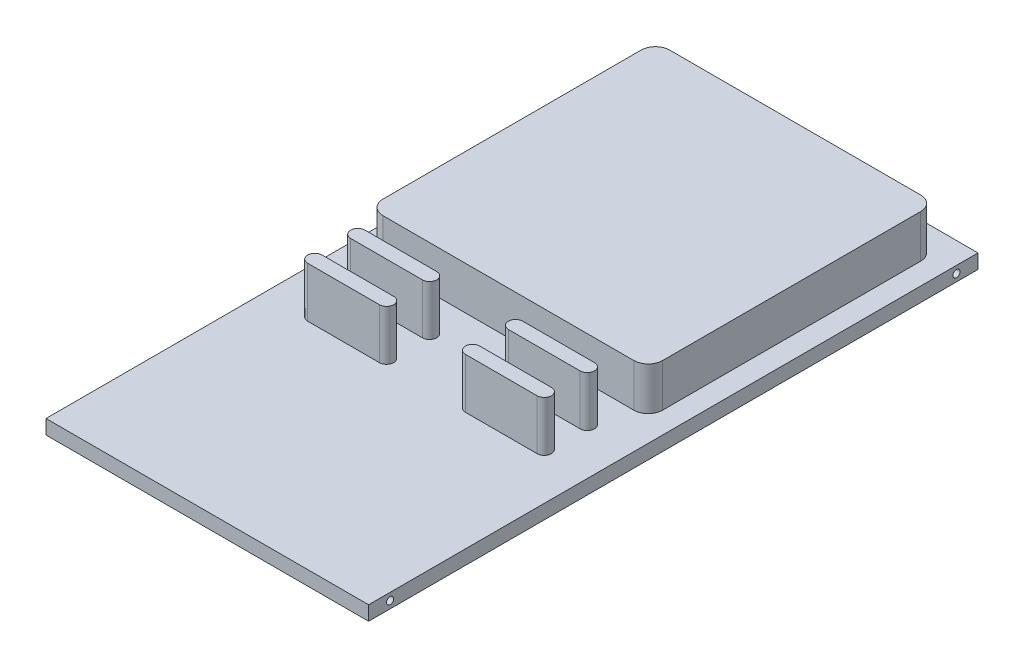
ISO-10303-21;
HEADER;
FILE_DESCRIPTION(('STEP AP214'),'2;1');
FILE_NAME('part.step','',(''),(''),'','','');
FILE_SCHEMA(('AUTOMOTIVE_DESIGN { 1 0 10303 214 1 1 1 1 }'));
ENDSEC;
DATA;
#1=APPLICATION_CONTEXT('core data for automotive mechanical design processes');
#2=APPLICATION_PROTOCOL_DEFINITION('international standard','automotive_design',2000,#1);
#3=PRODUCT_CONTEXT('',#1,'mechanical');
#4=PRODUCT('Part','Part','',(#3));
#5=PRODUCT_RELATED_PRODUCT_CATEGORY('part','',(#4));
#6=PRODUCT_DEFINITION_FORMATION('','',#4);
#7=PRODUCT_DEFINITION_CONTEXT('part definition',#1,'design');
#8=PRODUCT_DEFINITION('design','',#6,#7);
#9=PRODUCT_DEFINITION_SHAPE('','',#8);
#10=(LENGTH_UNIT() NAMED_UNIT(*) SI_UNIT(.MILLI.,.METRE.));
#11=(NAMED_UNIT(*) PLANE_ANGLE_UNIT() SI_UNIT($,.RADIAN.));
#12=(NAMED_UNIT(*) SI_UNIT($,.STERADIAN.) SOLID_ANGLE_UNIT());
#13=UNCERTAINTY_MEASURE_WITH_UNIT(LENGTH_MEASURE(1.E-05),#10,'distance_accuracy_value','');
#14=(GEOMETRIC_REPRESENTATION_CONTEXT(3) GLOBAL_UNCERTAINTY_ASSIGNED_CONTEXT((#13)) GLOBAL_UNIT_ASSIGNED_CONTEXT((#10,
#11,#12)) REPRESENTATION_CONTEXT('',''));
#15=CARTESIAN_POINT('',(0.,0.,0.));
#16=DIRECTION('',(0.,0.,1.));
#17=DIRECTION('',(1.,0.,0.));
#18=AXIS2_PLACEMENT_3D('',#15,#16,#17);
#19=CARTESIAN_POINT('',(0.,2.54,0.));
#20=DIRECTION('',(0.,-1.,0.));
#21=DIRECTION('',(0.,0.,-1.));
#22=AXIS2_PLACEMENT_3D('',#19,#20,#21);
#23=PLANE('',#22);
#24=CARTESIAN_POINT('',(48.895,2.54,-46.99));
#25=DIRECTION('',(0.,1.,0.));
#26=DIRECTION('',(0.,0.,-1.));
#27=AXIS2_PLACEMENT_3D('',#24,#25,#26);
#28=CIRCLE('',#27,1.27);
#29=CARTESIAN_POINT('',(48.895,2.54,-45.72));
#30=VERTEX_POINT('',#29);
#31=CARTESIAN_POINT('',(48.895,2.54,-48.26));
#32=VERTEX_POINT('',#31);
#33=EDGE_CURVE('E229',#30,#32,#28,.T.);
#34=ORIENTED_EDGE('',*,*,#33,.F.);
#35=DIRECTION('',(1.,0.,0.));
#36=VECTOR('',#35,1.);
#37=CARTESIAN_POINT('',(48.895,2.54,-45.72));
#38=LINE('',#37,#36);
#39=CARTESIAN_POINT('',(36.195,2.54,-45.72));
#40=VERTEX_POINT('',#39);
#41=EDGE_CURVE('E232',#40,#30,#38,.T.);
#42=ORIENTED_EDGE('',*,*,#41,.F.);
#43=CARTESIAN_POINT('',(36.195,2.54,-46.99));
#44=DIRECTION('',(0.,1.,0.));
#45=DIRECTION('',(0.,0.,-1.));
#46=AXIS2_PLACEMENT_3D('',#43,#44,#45);
#47=CIRCLE('',#46,1.27);
#48=CARTESIAN_POINT('',(36.195,2.54,-48.26));
#49=VERTEX_POINT('',#48);
#50=EDGE_CURVE('E253',#49,#40,#47,.T.);
#51=ORIENTED_EDGE('',*,*,#50,.F.);
#52=DIRECTION('',(-1.,0.,0.));
#53=VECTOR('',#52,1.);
#54=CARTESIAN_POINT('',(48.895,2.54,-48.26));
#55=LINE('',#54,#53);
#56=EDGE_CURVE('E235',#32,#49,#55,.T.);
#57=ORIENTED_EDGE('',*,*,#56,.F.);
#58=EDGE_LOOP('',(#34,#42,#51,#57));
#59=FACE_BOUND('',#58,.T.);
#60=CARTESIAN_POINT('',(48.895,2.54,-39.37));
#61=DIRECTION('',(0.,1.,0.));
#62=DIRECTION('',(0.,0.,-1.));
#63=AXIS2_PLACEMENT_3D('',#60,#61,#62);
#64=CIRCLE('',#63,1.27);
#65=CARTESIAN_POINT('',(48.895,2.54,-38.1));
#66=VERTEX_POINT('',#65);
#67=CARTESIAN_POINT('',(48.895,2.54,-40.64));
#68=VERTEX_POINT('',#67);
#69=EDGE_CURVE('E354',#66,#68,#64,.T.);
#70=ORIENTED_EDGE('',*,*,#69,.F.);
#71=DIRECTION('',(1.,0.,0.));
#72=VECTOR('',#71,1.);
#73=CARTESIAN_POINT('',(48.895,2.54,-38.1));
#74=LINE('',#73,#72);
#75=CARTESIAN_POINT('',(36.195,2.54,-38.1));
#76=VERTEX_POINT('',#75);
#77=EDGE_CURVE('E341',#76,#66,#74,.T.);
#78=ORIENTED_EDGE('',*,*,#77,.F.);
#79=CARTESIAN_POINT('',(36.195,2.54,-39.37));
#80=DIRECTION('',(0.,1.,0.));
#81=DIRECTION('',(0.,0.,-1.));
#82=AXIS2_PLACEMENT_3D('',#79,#80,#81);
#83=CIRCLE('',#82,1.27);
#84=CARTESIAN_POINT('',(36.195,2.54,-40.64));
#85=VERTEX_POINT('',#84);
#86=EDGE_CURVE('E345',#85,#76,#83,.T.);
#87=ORIENTED_EDGE('',*,*,#86,.F.);
#88=DIRECTION('',(-1.,0.,0.));
#89=VECTOR('',#88,1.);
#90=CARTESIAN_POINT('',(48.895,2.54,-40.64));
#91=LINE('',#90,#89);
#92=EDGE_CURVE('E350',#68,#85,#91,.T.);
#93=ORIENTED_EDGE('',*,*,#92,.F.);
#94=EDGE_LOOP('',(#70,#78,#87,#93));
#95=FACE_BOUND('',#94,.T.);
#96=DIRECTION('',(0.,0.,1.));
#97=VECTOR('',#96,1.);
#98=CARTESIAN_POINT('',(0.,2.54,0.));
#99=LINE('',#98,#97);
#100=CARTESIAN_POINT('',(0.,2.54,-107.95));
#101=VERTEX_POINT('',#100);
#102=CARTESIAN_POINT('',(0.,2.54,0.));
#103=VERTEX_POINT('',#102);
#104=EDGE_CURVE('E415',#101,#103,#99,.T.);
#105=ORIENTED_EDGE('',*,*,#104,.T.);
#106=DIRECTION('',(1.,0.,0.));
#107=VECTOR('',#106,1.);
#108=CARTESIAN_POINT('',(0.,2.54,0.));
#109=LINE('',#108,#107);
#110=CARTESIAN_POINT('',(57.15,2.54,0.));
#111=VERTEX_POINT('',#110);
#112=EDGE_CURVE('E419',#103,#111,#109,.T.);
#113=ORIENTED_EDGE('',*,*,#112,.T.);
#114=DIRECTION('',(0.,0.,-1.));
#115=VECTOR('',#114,1.);
#116=CARTESIAN_POINT('',(57.15,2.54,0.));
#117=LINE('',#116,#115);
#118=CARTESIAN_POINT('',(57.15,2.54,-107.95));
#119=VERTEX_POINT('',#118);
#120=EDGE_CURVE('E423',#111,#119,#117,.T.);
#121=ORIENTED_EDGE('',*,*,#120,.T.);
#122=DIRECTION('',(-1.,0.,0.));
#123=VECTOR('',#122,1.);
#124=CARTESIAN_POINT('',(0.,2.54,-107.95));
#125=LINE('',#124,#123);
#126=EDGE_CURVE('E426',#119,#101,#125,.T.);
#127=ORIENTED_EDGE('',*,*,#126,.T.);
#128=EDGE_LOOP('',(#105,#113,#121,#127));
#129=FACE_BOUND('',#128,.T.);
#130=CARTESIAN_POINT('',(8.255,2.54,-39.37));
#131=DIRECTION('',(0.,1.,0.));
#132=DIRECTION('',(0.,0.,1.));
#133=AXIS2_PLACEMENT_3D('',#130,#131,#132);
#134=CIRCLE('',#133,1.27);
#135=CARTESIAN_POINT('',(8.255,2.54,-40.64));
#136=VERTEX_POINT('',#135);
#137=CARTESIAN_POINT('',(8.255,2.54,-38.1));
#138=VERTEX_POINT('',#137);
#139=EDGE_CURVE('E358',#136,#138,#134,.T.);
#140=ORIENTED_EDGE('',*,*,#139,.F.);
#141=DIRECTION('',(-1.,0.,0.));
#142=VECTOR('',#141,1.);
#143=CARTESIAN_POINT('',(8.255,2.54,-40.64));
#144=LINE('',#143,#142);
#145=CARTESIAN_POINT('',(20.955,2.54,-40.64));
#146=VERTEX_POINT('',#145);
#147=EDGE_CURVE('E375',#146,#136,#144,.T.);
#148=ORIENTED_EDGE('',*,*,#147,.F.);
#149=CARTESIAN_POINT('',(20.955,2.54,-39.37));
#150=DIRECTION('',(0.,1.,0.));
#151=DIRECTION('',(0.,0.,1.));
#152=AXIS2_PLACEMENT_3D('',#149,#150,#151);
#153=CIRCLE('',#152,1.27);
#154=CARTESIAN_POINT('',(20.955,2.54,-38.1));
#155=VERTEX_POINT('',#154);
#156=EDGE_CURVE('E392',#155,#146,#153,.T.);
#157=ORIENTED_EDGE('',*,*,#156,.F.);
#158=DIRECTION('',(1.,0.,0.));
#159=VECTOR('',#158,1.);
#160=CARTESIAN_POINT('',(8.255,2.54,-38.1));
#161=LINE('',#160,#159);
#162=EDGE_CURVE('E388',#138,#155,#161,.T.);
#163=ORIENTED_EDGE('',*,*,#162,.F.);
#164=EDGE_LOOP('',(#140,#148,#157,#163));
#165=FACE_BOUND('',#164,.T.);
#166=CARTESIAN_POINT('',(8.255,2.54,-46.99));
#167=DIRECTION('',(0.,1.,0.));
#168=DIRECTION('',(0.,0.,1.));
#169=AXIS2_PLACEMENT_3D('',#166,#167,#168);
#170=CIRCLE('',#169,1.27);
#171=CARTESIAN_POINT('',(8.255,2.54,-48.26));
#172=VERTEX_POINT('',#171);
#173=CARTESIAN_POINT('',(8.255,2.54,-45.72));
#174=VERTEX_POINT('',#173);
#175=EDGE_CURVE('E309',#172,#174,#170,.T.);
#176=ORIENTED_EDGE('',*,*,#175,.F.);
#177=DIRECTION('',(-1.,0.,0.));
#178=VECTOR('',#177,1.);
#179=CARTESIAN_POINT('',(8.255,2.54,-48.26));
#180=LINE('',#179,#178);
#181=CARTESIAN_POINT('',(20.955,2.54,-48.26));
#182=VERTEX_POINT('',#181);
#183=EDGE_CURVE('E296',#182,#172,#180,.T.);
#184=ORIENTED_EDGE('',*,*,#183,.F.);
#185=CARTESIAN_POINT('',(20.955,2.54,-46.99));
#186=DIRECTION('',(0.,1.,0.));
#187=DIRECTION('',(0.,0.,1.));
#188=AXIS2_PLACEMENT_3D('',#185,#186,#187);
#189=CIRCLE('',#188,1.27);
#190=CARTESIAN_POINT('',(20.955,2.54,-45.72));
#191=VERTEX_POINT('',#190);
#192=EDGE_CURVE('E300',#191,#182,#189,.T.);
#193=ORIENTED_EDGE('',*,*,#192,.F.);
#194=DIRECTION('',(1.,0.,0.));
#195=VECTOR('',#194,1.);
#196=CARTESIAN_POINT('',(8.255,2.54,-45.72));
#197=LINE('',#196,#195);
#198=EDGE_CURVE('E305',#174,#191,#197,.T.);
#199=ORIENTED_EDGE('',*,*,#198,.F.);
#200=EDGE_LOOP('',(#176,#184,#193,#199));
#201=FACE_BOUND('',#200,.T.);
#202=DIRECTION('',(0.,0.,-1.));
#203=VECTOR('',#202,1.);
#204=CARTESIAN_POINT('',(53.34,2.54,-53.34));
#205=LINE('',#204,#203);
#206=CARTESIAN_POINT('',(53.34,2.54,-55.88));
#207=VERTEX_POINT('',#206);
#208=CARTESIAN_POINT('',(53.34,2.54,-101.6));
#209=VERTEX_POINT('',#208);
#210=EDGE_CURVE('E512',#207,#209,#205,.T.);
#211=ORIENTED_EDGE('',*,*,#210,.F.);
#212=CARTESIAN_POINT('',(50.8,2.54,-55.88));
#213=DIRECTION('',(0.,-1.,0.));
#214=DIRECTION('',(0.,0.,-1.));
#215=AXIS2_PLACEMENT_3D('',#212,#213,#214);
#216=CIRCLE('',#215,2.54);
#217=CARTESIAN_POINT('',(50.8,2.54,-53.34));
#218=VERTEX_POINT('',#217);
#219=EDGE_CURVE('E495',#207,#218,#216,.T.);
#220=ORIENTED_EDGE('',*,*,#219,.T.);
#221=DIRECTION('',(1.,0.,0.));
#222=VECTOR('',#221,1.);
#223=CARTESIAN_POINT('',(3.81,2.54,-53.34));
#224=LINE('',#223,#222);
#225=CARTESIAN_POINT('',(6.35,2.54,-53.34));
#226=VERTEX_POINT('',#225);
#227=EDGE_CURVE('E543',#226,#218,#224,.T.);
#228=ORIENTED_EDGE('',*,*,#227,.F.);
#229=CARTESIAN_POINT('',(6.35,2.54,-55.88));
#230=DIRECTION('',(0.,-1.,0.));
#231=DIRECTION('',(0.,0.,-1.));
#232=AXIS2_PLACEMENT_3D('',#229,#230,#231);
#233=CIRCLE('',#232,2.54);
#234=CARTESIAN_POINT('',(3.81,2.54,-55.88));
#235=VERTEX_POINT('',#234);
#236=EDGE_CURVE('E11',#226,#235,#233,.T.);
#237=ORIENTED_EDGE('',*,*,#236,.T.);
#238=DIRECTION('',(0.,0.,1.));
#239=VECTOR('',#238,1.);
#240=CARTESIAN_POINT('',(3.81,2.54,-53.34));
#241=LINE('',#240,#239);
#242=CARTESIAN_POINT('',(3.81,2.54,-101.6));
#243=VERTEX_POINT('',#242);
#244=EDGE_CURVE('E505',#243,#235,#241,.T.);
#245=ORIENTED_EDGE('',*,*,#244,.F.);
#246=CARTESIAN_POINT('',(6.35,2.54,-101.6));
#247=DIRECTION('',(0.,-1.,0.));
#248=DIRECTION('',(0.,0.,-1.));
#249=AXIS2_PLACEMENT_3D('',#246,#247,#248);
#250=CIRCLE('',#249,2.54);
#251=CARTESIAN_POINT('',(6.35,2.54,-104.14));
#252=VERTEX_POINT('',#251);
#253=EDGE_CURVE('E54',#243,#252,#250,.T.);
#254=ORIENTED_EDGE('',*,*,#253,.T.);
#255=DIRECTION('',(-1.,0.,0.));
#256=VECTOR('',#255,1.);
#257=CARTESIAN_POINT('',(3.81,2.54,-104.14));
#258=LINE('',#257,#256);
#259=CARTESIAN_POINT('',(50.8,2.54,-104.14));
#260=VERTEX_POINT('',#259);
#261=EDGE_CURVE('E504',#260,#252,#258,.T.);
#262=ORIENTED_EDGE('',*,*,#261,.F.);
#263=CARTESIAN_POINT('',(50.8,2.54,-101.6));
#264=DIRECTION('',(0.,-1.,0.));
#265=DIRECTION('',(0.,0.,-1.));
#266=AXIS2_PLACEMENT_3D('',#263,#264,#265);
#267=CIRCLE('',#266,2.54);
#268=EDGE_CURVE('E498',#260,#209,#267,.T.);
#269=ORIENTED_EDGE('',*,*,#268,.T.);
#270=EDGE_LOOP('',(#211,#220,#228,#237,#245,#254,#262,#269));
#271=FACE_BOUND('',#270,.T.);
#272=ADVANCED_FACE('F45',(#59,#95,#129,#165,#201,#271),#23,.F.);
#273=CARTESIAN_POINT('',(0.,2.54,0.));
#274=DIRECTION('',(1.,0.,0.));
#275=DIRECTION('',(0.,0.,-1.));
#276=AXIS2_PLACEMENT_3D('',#273,#274,#275);
#277=PLANE('',#276);
#278=CARTESIAN_POINT('',(0.,1.27,-104.14));
#279=DIRECTION('',(-1.,0.,0.));
#280=DIRECTION('',(0.,0.,1.));
#281=AXIS2_PLACEMENT_3D('',#278,#279,#280);
#282=CIRCLE('',#281,0.635000000000002);
#283=CARTESIAN_POINT('',(0.,1.27,-103.505));
#284=VERTEX_POINT('',#283);
#285=EDGE_CURVE('E568',#284,#284,#282,.T.);
#286=ORIENTED_EDGE('',*,*,#285,.F.);
#287=EDGE_LOOP('',(#286));
#288=FACE_BOUND('',#287,.T.);
#289=CARTESIAN_POINT('',(0.,1.27,-3.80999999999999));
#290=DIRECTION('',(-1.,0.,0.));
#291=DIRECTION('',(0.,0.,-1.));
#292=AXIS2_PLACEMENT_3D('',#289,#290,#291);
#293=CIRCLE('',#292,0.635000000000002);
#294=CARTESIAN_POINT('',(0.,1.27,-4.445));
#295=VERTEX_POINT('',#294);
#296=EDGE_CURVE('E572',#295,#295,#293,.T.);
#297=ORIENTED_EDGE('',*,*,#296,.F.);
#298=EDGE_LOOP('',(#297));
#299=FACE_BOUND('',#298,.T.);
#300=DIRECTION('',(0.,0.,1.));
#301=VECTOR('',#300,1.);
#302=CARTESIAN_POINT('',(0.,0.,0.));
#303=LINE('',#302,#301);
#304=CARTESIAN_POINT('',(0.,0.,-107.95));
#305=VERTEX_POINT('',#304);
#306=CARTESIAN_POINT('',(0.,0.,0.));
#307=VERTEX_POINT('',#306);
#308=EDGE_CURVE('E414',#305,#307,#303,.T.);
#309=ORIENTED_EDGE('',*,*,#308,.T.);
#310=DIRECTION('',(0.,-1.,0.));
#311=VECTOR('',#310,1.);
#312=CARTESIAN_POINT('',(0.,2.54,0.));
#313=LINE('',#312,#311);
#314=EDGE_CURVE('E452',#103,#307,#313,.T.);
#315=ORIENTED_EDGE('',*,*,#314,.F.);
#316=ORIENTED_EDGE('',*,*,#104,.F.);
#317=DIRECTION('',(0.,-1.,0.));
#318=VECTOR('',#317,1.);
#319=CARTESIAN_POINT('',(0.,2.54,-107.95));
#320=LINE('',#319,#318);
#321=EDGE_CURVE('E429',#101,#305,#320,.T.);
#322=ORIENTED_EDGE('',*,*,#321,.T.);
#323=EDGE_LOOP('',(#309,#315,#316,#322));
#324=FACE_BOUND('',#323,.T.);
#325=ADVANCED_FACE('F603',(#288,#299,#324),#277,.F.);
#326=CARTESIAN_POINT('',(0.,2.54,0.));
#327=DIRECTION('',(0.,0.,-1.));
#328=DIRECTION('',(-1.,0.,0.));
#329=AXIS2_PLACEMENT_3D('',#326,#327,#328);
#330=PLANE('',#329);
#331=DIRECTION('',(1.,0.,0.));
#332=VECTOR('',#331,1.);
#333=CARTESIAN_POINT('',(0.,0.,0.));
#334=LINE('',#333,#332);
#335=CARTESIAN_POINT('',(57.15,0.,0.));
#336=VERTEX_POINT('',#335);
#337=EDGE_CURVE('E433',#307,#336,#334,.T.);
#338=ORIENTED_EDGE('',*,*,#337,.T.);
#339=DIRECTION('',(0.,-1.,0.));
#340=VECTOR('',#339,1.);
#341=CARTESIAN_POINT('',(57.15,2.54,0.));
#342=LINE('',#341,#340);
#343=EDGE_CURVE('E448',#111,#336,#342,.T.);
#344=ORIENTED_EDGE('',*,*,#343,.F.);
#345=ORIENTED_EDGE('',*,*,#112,.F.);
#346=ORIENTED_EDGE('',*,*,#314,.T.);
#347=EDGE_LOOP('',(#338,#344,#345,#346));
#348=FACE_BOUND('',#347,.T.);
#349=ADVANCED_FACE('F610',(#348),#330,.F.);
#350=CARTESIAN_POINT('',(57.15,2.54,0.));
#351=DIRECTION('',(-1.,0.,0.));
#352=DIRECTION('',(0.,0.,1.));
#353=AXIS2_PLACEMENT_3D('',#350,#351,#352);
#354=PLANE('',#353);
#355=CARTESIAN_POINT('',(57.15,1.27,-104.14));
#356=DIRECTION('',(-1.,0.,0.));
#357=DIRECTION('',(0.,0.,1.));
#358=AXIS2_PLACEMENT_3D('',#355,#356,#357);
#359=CIRCLE('',#358,0.635000000000002);
#360=CARTESIAN_POINT('',(57.15,1.27,-103.505));
#361=VERTEX_POINT('',#360);
#362=EDGE_CURVE('E552',#361,#361,#359,.T.);
#363=ORIENTED_EDGE('',*,*,#362,.T.);
#364=EDGE_LOOP('',(#363));
#365=FACE_BOUND('',#364,.T.);
#366=CARTESIAN_POINT('',(57.15,1.27,-3.80999999999999));
#367=DIRECTION('',(-1.,0.,0.));
#368=DIRECTION('',(0.,0.,-1.));
#369=AXIS2_PLACEMENT_3D('',#366,#367,#368);
#370=CIRCLE('',#369,0.635000000000002);
#371=CARTESIAN_POINT('',(57.15,1.27,-4.445));
#372=VERTEX_POINT('',#371);
#373=EDGE_CURVE('E532',#372,#372,#370,.T.);
#374=ORIENTED_EDGE('',*,*,#373,.T.);
#375=EDGE_LOOP('',(#374));
#376=FACE_BOUND('',#375,.T.);
#377=DIRECTION('',(0.,0.,-1.));
#378=VECTOR('',#377,1.);
#379=CARTESIAN_POINT('',(57.15,0.,0.));
#380=LINE('',#379,#378);
#381=CARTESIAN_POINT('',(57.15,0.,-107.95));
#382=VERTEX_POINT('',#381);
#383=EDGE_CURVE('E436',#336,#382,#380,.T.);
#384=ORIENTED_EDGE('',*,*,#383,.T.);
#385=DIRECTION('',(0.,-1.,0.));
#386=VECTOR('',#385,1.);
#387=CARTESIAN_POINT('',(57.15,2.54,-107.95));
#388=LINE('',#387,#386);
#389=EDGE_CURVE('E444',#119,#382,#388,.T.);
#390=ORIENTED_EDGE('',*,*,#389,.F.);
#391=ORIENTED_EDGE('',*,*,#120,.F.);
#392=ORIENTED_EDGE('',*,*,#343,.T.);
#393=EDGE_LOOP('',(#384,#390,#391,#392));
#394=FACE_BOUND('',#393,.T.);
#395=ADVANCED_FACE('F624',(#365,#376,#394),#354,.F.);
#396=CARTESIAN_POINT('',(0.,2.54,-107.95));
#397=DIRECTION('',(0.,0.,1.));
#398=DIRECTION('',(1.,0.,0.));
#399=AXIS2_PLACEMENT_3D('',#396,#397,#398);
#400=PLANE('',#399);
#401=DIRECTION('',(-1.,0.,0.));
#402=VECTOR('',#401,1.);
#403=CARTESIAN_POINT('',(0.,0.,-107.95));
#404=LINE('',#403,#402);
#405=EDGE_CURVE('E420',#382,#305,#404,.T.);
#406=ORIENTED_EDGE('',*,*,#405,.T.);
#407=ORIENTED_EDGE('',*,*,#321,.F.);
#408=ORIENTED_EDGE('',*,*,#126,.F.);
#409=ORIENTED_EDGE('',*,*,#389,.T.);
#410=EDGE_LOOP('',(#406,#407,#408,#409));
#411=FACE_BOUND('',#410,.T.);
#412=ADVANCED_FACE('F620',(#411),#400,.F.);
#413=CARTESIAN_POINT('',(0.,0.,0.));
#414=DIRECTION('',(0.,-1.,0.));
#415=DIRECTION('',(0.,0.,-1.));
#416=AXIS2_PLACEMENT_3D('',#413,#414,#415);
#417=PLANE('',#416);
#418=ORIENTED_EDGE('',*,*,#308,.F.);
#419=ORIENTED_EDGE('',*,*,#405,.F.);
#420=ORIENTED_EDGE('',*,*,#383,.F.);
#421=ORIENTED_EDGE('',*,*,#337,.F.);
#422=EDGE_LOOP('',(#418,#419,#420,#421));
#423=FACE_BOUND('',#422,.T.);
#424=ADVANCED_FACE('F617',(#423),#417,.T.);
#425=CARTESIAN_POINT('',(8.255,11.43,-39.37));
#426=DIRECTION('',(0.,-1.,0.));
#427=DIRECTION('',(0.,0.,-1.));
#428=AXIS2_PLACEMENT_3D('',#425,#426,#427);
#429=CYLINDRICAL_SURFACE('',#428,1.27);
#430=ORIENTED_EDGE('',*,*,#139,.T.);
#431=DIRECTION('',(0.,-1.,0.));
#432=VECTOR('',#431,1.);
#433=CARTESIAN_POINT('',(8.255,11.43,-38.1));
#434=LINE('',#433,#432);
#435=CARTESIAN_POINT('',(8.255,11.43,-38.1));
#436=VERTEX_POINT('',#435);
#437=EDGE_CURVE('E410',#436,#138,#434,.T.);
#438=ORIENTED_EDGE('',*,*,#437,.F.);
#439=CARTESIAN_POINT('',(8.255,11.43,-39.37));
#440=DIRECTION('',(0.,1.,0.));
#441=DIRECTION('',(0.,0.,1.));
#442=AXIS2_PLACEMENT_3D('',#439,#440,#441);
#443=CIRCLE('',#442,1.27);
#444=CARTESIAN_POINT('',(8.255,11.43,-40.64));
#445=VERTEX_POINT('',#444);
#446=EDGE_CURVE('E370',#445,#436,#443,.T.);
#447=ORIENTED_EDGE('',*,*,#446,.F.);
#448=DIRECTION('',(0.,-1.,0.));
#449=VECTOR('',#448,1.);
#450=CARTESIAN_POINT('',(8.255,11.43,-40.64));
#451=LINE('',#450,#449);
#452=EDGE_CURVE('E384',#445,#136,#451,.T.);
#453=ORIENTED_EDGE('',*,*,#452,.T.);
#454=EDGE_LOOP('',(#430,#438,#447,#453));
#455=FACE_BOUND('',#454,.T.);
#456=ADVANCED_FACE('F615',(#455),#429,.T.);
#457=CARTESIAN_POINT('',(8.255,11.43,-38.1));
#458=DIRECTION('',(0.,0.,-1.));
#459=DIRECTION('',(-1.,0.,0.));
#460=AXIS2_PLACEMENT_3D('',#457,#458,#459);
#461=PLANE('',#460);
#462=ORIENTED_EDGE('',*,*,#162,.T.);
#463=DIRECTION('',(0.,-1.,0.));
#464=VECTOR('',#463,1.);
#465=CARTESIAN_POINT('',(20.955,11.43,-38.1));
#466=LINE('',#465,#464);
#467=CARTESIAN_POINT('',(20.955,11.43,-38.1));
#468=VERTEX_POINT('',#467);
#469=EDGE_CURVE('E406',#468,#155,#466,.T.);
#470=ORIENTED_EDGE('',*,*,#469,.F.);
#471=DIRECTION('',(1.,0.,0.));
#472=VECTOR('',#471,1.);
#473=CARTESIAN_POINT('',(8.255,11.43,-38.1));
#474=LINE('',#473,#472);
#475=EDGE_CURVE('E374',#436,#468,#474,.T.);
#476=ORIENTED_EDGE('',*,*,#475,.F.);
#477=ORIENTED_EDGE('',*,*,#437,.T.);
#478=EDGE_LOOP('',(#462,#470,#476,#477));
#479=FACE_BOUND('',#478,.T.);
#480=ADVANCED_FACE('F1043',(#479),#461,.F.);
#481=CARTESIAN_POINT('',(20.955,11.43,-39.37));
#482=DIRECTION('',(0.,-1.,0.));
#483=DIRECTION('',(0.,0.,-1.));
#484=AXIS2_PLACEMENT_3D('',#481,#482,#483);
#485=CYLINDRICAL_SURFACE('',#484,1.27);
#486=ORIENTED_EDGE('',*,*,#156,.T.);
#487=DIRECTION('',(0.,-1.,0.));
#488=VECTOR('',#487,1.);
#489=CARTESIAN_POINT('',(20.955,11.43,-40.64));
#490=LINE('',#489,#488);
#491=CARTESIAN_POINT('',(20.955,11.43,-40.64));
#492=VERTEX_POINT('',#491);
#493=EDGE_CURVE('E402',#492,#146,#490,.T.);
#494=ORIENTED_EDGE('',*,*,#493,.F.);
#495=CARTESIAN_POINT('',(20.955,11.43,-39.37));
#496=DIRECTION('',(0.,1.,0.));
#497=DIRECTION('',(0.,0.,1.));
#498=AXIS2_PLACEMENT_3D('',#495,#496,#497);
#499=CIRCLE('',#498,1.27);
#500=EDGE_CURVE('E378',#468,#492,#499,.T.);
#501=ORIENTED_EDGE('',*,*,#500,.F.);
#502=ORIENTED_EDGE('',*,*,#469,.T.);
#503=EDGE_LOOP('',(#486,#494,#501,#502));
#504=FACE_BOUND('',#503,.T.);
#505=ADVANCED_FACE('F1033',(#504),#485,.T.);
#506=CARTESIAN_POINT('',(8.255,11.43,-40.64));
#507=DIRECTION('',(0.,0.,1.));
#508=DIRECTION('',(1.,0.,0.));
#509=AXIS2_PLACEMENT_3D('',#506,#507,#508);
#510=PLANE('',#509);
#511=ORIENTED_EDGE('',*,*,#147,.T.);
#512=ORIENTED_EDGE('',*,*,#452,.F.);
#513=DIRECTION('',(-1.,0.,0.));
#514=VECTOR('',#513,1.);
#515=CARTESIAN_POINT('',(8.255,11.43,-40.64));
#516=LINE('',#515,#514);
#517=EDGE_CURVE('E381',#492,#445,#516,.T.);
#518=ORIENTED_EDGE('',*,*,#517,.F.);
#519=ORIENTED_EDGE('',*,*,#493,.T.);
#520=EDGE_LOOP('',(#511,#512,#518,#519));
#521=FACE_BOUND('',#520,.T.);
#522=ADVANCED_FACE('F1023',(#521),#510,.F.);
#523=CARTESIAN_POINT('',(8.255,11.43,-39.37));
#524=DIRECTION('',(0.,1.,0.));
#525=DIRECTION('',(0.,0.,1.));
#526=AXIS2_PLACEMENT_3D('',#523,#524,#525);
#527=PLANE('',#526);
#528=ORIENTED_EDGE('',*,*,#446,.T.);
#529=ORIENTED_EDGE('',*,*,#475,.T.);
#530=ORIENTED_EDGE('',*,*,#500,.T.);
#531=ORIENTED_EDGE('',*,*,#517,.T.);
#532=EDGE_LOOP('',(#528,#529,#530,#531));
#533=FACE_BOUND('',#532,.T.);
#534=ADVANCED_FACE('F1013',(#533),#527,.T.);
#535=CARTESIAN_POINT('',(48.895,11.43,-39.37));
#536=DIRECTION('',(0.,-1.,0.));
#537=DIRECTION('',(0.,0.,-1.));
#538=AXIS2_PLACEMENT_3D('',#535,#536,#537);
#539=CYLINDRICAL_SURFACE('',#538,1.27);
#540=ORIENTED_EDGE('',*,*,#69,.T.);
#541=DIRECTION('',(0.,-1.,0.));
#542=VECTOR('',#541,1.);
#543=CARTESIAN_POINT('',(48.895,11.43,-40.64));
#544=LINE('',#543,#542);
#545=CARTESIAN_POINT('',(48.895,11.43,-40.64));
#546=VERTEX_POINT('',#545);
#547=EDGE_CURVE('E313',#546,#68,#544,.T.);
#548=ORIENTED_EDGE('',*,*,#547,.F.);
#549=CARTESIAN_POINT('',(48.895,11.43,-39.37));
#550=DIRECTION('',(0.,1.,0.));
#551=DIRECTION('',(0.,0.,-1.));
#552=AXIS2_PLACEMENT_3D('',#549,#550,#551);
#553=CIRCLE('',#552,1.27);
#554=CARTESIAN_POINT('',(48.895,11.43,-38.1));
#555=VERTEX_POINT('',#554);
#556=EDGE_CURVE('E346',#555,#546,#553,.T.);
#557=ORIENTED_EDGE('',*,*,#556,.F.);
#558=DIRECTION('',(0.,-1.,0.));
#559=VECTOR('',#558,1.);
#560=CARTESIAN_POINT('',(48.895,11.43,-38.1));
#561=LINE('',#560,#559);
#562=EDGE_CURVE('E336',#555,#66,#561,.T.);
#563=ORIENTED_EDGE('',*,*,#562,.T.);
#564=EDGE_LOOP('',(#540,#548,#557,#563));
#565=FACE_BOUND('',#564,.T.);
#566=ADVANCED_FACE('F1003',(#565),#539,.T.);
#567=CARTESIAN_POINT('',(48.895,11.43,-40.64));
#568=DIRECTION('',(0.,0.,1.));
#569=DIRECTION('',(1.,0.,0.));
#570=AXIS2_PLACEMENT_3D('',#567,#568,#569);
#571=PLANE('',#570);
#572=ORIENTED_EDGE('',*,*,#92,.T.);
#573=DIRECTION('',(0.,-1.,0.));
#574=VECTOR('',#573,1.);
#575=CARTESIAN_POINT('',(36.195,11.43,-40.64));
#576=LINE('',#575,#574);
#577=CARTESIAN_POINT('',(36.195,11.43,-40.64));
#578=VERTEX_POINT('',#577);
#579=EDGE_CURVE('E328',#578,#85,#576,.T.);
#580=ORIENTED_EDGE('',*,*,#579,.F.);
#581=DIRECTION('',(-1.,0.,0.));
#582=VECTOR('',#581,1.);
#583=CARTESIAN_POINT('',(48.895,11.43,-40.64));
#584=LINE('',#583,#582);
#585=EDGE_CURVE('E364',#546,#578,#584,.T.);
#586=ORIENTED_EDGE('',*,*,#585,.F.);
#587=ORIENTED_EDGE('',*,*,#547,.T.);
#588=EDGE_LOOP('',(#572,#580,#586,#587));
#589=FACE_BOUND('',#588,.T.);
#590=ADVANCED_FACE('F993',(#589),#571,.F.);
#591=CARTESIAN_POINT('',(36.195,11.43,-39.37));
#592=DIRECTION('',(0.,-1.,0.));
#593=DIRECTION('',(0.,0.,-1.));
#594=AXIS2_PLACEMENT_3D('',#591,#592,#593);
#595=CYLINDRICAL_SURFACE('',#594,1.27);
#596=ORIENTED_EDGE('',*,*,#86,.T.);
#597=DIRECTION('',(0.,-1.,0.));
#598=VECTOR('',#597,1.);
#599=CARTESIAN_POINT('',(36.195,11.43,-38.1));
#600=LINE('',#599,#598);
#601=CARTESIAN_POINT('',(36.195,11.43,-38.1));
#602=VERTEX_POINT('',#601);
#603=EDGE_CURVE('E332',#602,#76,#600,.T.);
#604=ORIENTED_EDGE('',*,*,#603,.F.);
#605=CARTESIAN_POINT('',(36.195,11.43,-39.37));
#606=DIRECTION('',(0.,1.,0.));
#607=DIRECTION('',(0.,0.,-1.));
#608=AXIS2_PLACEMENT_3D('',#605,#606,#607);
#609=CIRCLE('',#608,1.27);
#610=EDGE_CURVE('E361',#578,#602,#609,.T.);
#611=ORIENTED_EDGE('',*,*,#610,.F.);
#612=ORIENTED_EDGE('',*,*,#579,.T.);
#613=EDGE_LOOP('',(#596,#604,#611,#612));
#614=FACE_BOUND('',#613,.T.);
#615=ADVANCED_FACE('F983',(#614),#595,.T.);
#616=CARTESIAN_POINT('',(48.895,11.43,-38.1));
#617=DIRECTION('',(0.,0.,-1.));
#618=DIRECTION('',(-1.,0.,0.));
#619=AXIS2_PLACEMENT_3D('',#616,#617,#618);
#620=PLANE('',#619);
#621=ORIENTED_EDGE('',*,*,#77,.T.);
#622=ORIENTED_EDGE('',*,*,#562,.F.);
#623=DIRECTION('',(1.,0.,0.));
#624=VECTOR('',#623,1.);
#625=CARTESIAN_POINT('',(48.895,11.43,-38.1));
#626=LINE('',#625,#624);
#627=EDGE_CURVE('E340',#602,#555,#626,.T.);
#628=ORIENTED_EDGE('',*,*,#627,.F.);
#629=ORIENTED_EDGE('',*,*,#603,.T.);
#630=EDGE_LOOP('',(#621,#622,#628,#629));
#631=FACE_BOUND('',#630,.T.);
#632=ADVANCED_FACE('F973',(#631),#620,.F.);
#633=CARTESIAN_POINT('',(48.895,11.43,-39.37));
#634=DIRECTION('',(0.,-1.,0.));
#635=DIRECTION('',(0.,0.,-1.));
#636=AXIS2_PLACEMENT_3D('',#633,#634,#635);
#637=PLANE('',#636);
#638=ORIENTED_EDGE('',*,*,#556,.T.);
#639=ORIENTED_EDGE('',*,*,#585,.T.);
#640=ORIENTED_EDGE('',*,*,#610,.T.);
#641=ORIENTED_EDGE('',*,*,#627,.T.);
#642=EDGE_LOOP('',(#638,#639,#640,#641));
#643=FACE_BOUND('',#642,.T.);
#644=ADVANCED_FACE('F964',(#643),#637,.F.);
#645=CARTESIAN_POINT('',(8.255,11.43,-46.99));
#646=DIRECTION('',(0.,-1.,0.));
#647=DIRECTION('',(0.,0.,-1.));
#648=AXIS2_PLACEMENT_3D('',#645,#646,#647);
#649=CYLINDRICAL_SURFACE('',#648,1.27);
#650=ORIENTED_EDGE('',*,*,#175,.T.);
#651=DIRECTION('',(0.,-1.,0.));
#652=VECTOR('',#651,1.);
#653=CARTESIAN_POINT('',(8.255,11.43,-45.72));
#654=LINE('',#653,#652);
#655=CARTESIAN_POINT('',(8.255,11.43,-45.72));
#656=VERTEX_POINT('',#655);
#657=EDGE_CURVE('E241',#656,#174,#654,.T.);
#658=ORIENTED_EDGE('',*,*,#657,.F.);
#659=CARTESIAN_POINT('',(8.255,11.43,-46.99));
#660=DIRECTION('',(0.,1.,0.));
#661=DIRECTION('',(0.,0.,1.));
#662=AXIS2_PLACEMENT_3D('',#659,#660,#661);
#663=CIRCLE('',#662,1.27);
#664=CARTESIAN_POINT('',(8.255,11.43,-48.26));
#665=VERTEX_POINT('',#664);
#666=EDGE_CURVE('E301',#665,#656,#663,.T.);
#667=ORIENTED_EDGE('',*,*,#666,.F.);
#668=DIRECTION('',(0.,-1.,0.));
#669=VECTOR('',#668,1.);
#670=CARTESIAN_POINT('',(8.255,11.43,-48.26));
#671=LINE('',#670,#669);
#672=EDGE_CURVE('E291',#665,#172,#671,.T.);
#673=ORIENTED_EDGE('',*,*,#672,.T.);
#674=EDGE_LOOP('',(#650,#658,#667,#673));
#675=FACE_BOUND('',#674,.T.);
#676=ADVANCED_FACE('F954',(#675),#649,.T.);
#677=CARTESIAN_POINT('',(8.255,11.43,-45.72));
#678=DIRECTION('',(0.,0.,-1.));
#679=DIRECTION('',(-1.,0.,0.));
#680=AXIS2_PLACEMENT_3D('',#677,#678,#679);
#681=PLANE('',#680);
#682=ORIENTED_EDGE('',*,*,#198,.T.);
#683=DIRECTION('',(0.,-1.,0.));
#684=VECTOR('',#683,1.);
#685=CARTESIAN_POINT('',(20.955,11.43,-45.72));
#686=LINE('',#685,#684);
#687=CARTESIAN_POINT('',(20.955,11.43,-45.72));
#688=VERTEX_POINT('',#687);
#689=EDGE_CURVE('E283',#688,#191,#686,.T.);
#690=ORIENTED_EDGE('',*,*,#689,.F.);
#691=DIRECTION('',(1.,0.,0.));
#692=VECTOR('',#691,1.);
#693=CARTESIAN_POINT('',(8.255,11.43,-45.72));
#694=LINE('',#693,#692);
#695=EDGE_CURVE('E319',#656,#688,#694,.T.);
#696=ORIENTED_EDGE('',*,*,#695,.F.);
#697=ORIENTED_EDGE('',*,*,#657,.T.);
#698=EDGE_LOOP('',(#682,#690,#696,#697));
#699=FACE_BOUND('',#698,.T.);
#700=ADVANCED_FACE('F944',(#699),#681,.F.);
#701=CARTESIAN_POINT('',(20.955,11.43,-46.99));
#702=DIRECTION('',(0.,-1.,0.));
#703=DIRECTION('',(0.,0.,-1.));
#704=AXIS2_PLACEMENT_3D('',#701,#702,#703);
#705=CYLINDRICAL_SURFACE('',#704,1.27);
#706=ORIENTED_EDGE('',*,*,#192,.T.);
#707=DIRECTION('',(0.,-1.,0.));
#708=VECTOR('',#707,1.);
#709=CARTESIAN_POINT('',(20.955,11.43,-48.26));
#710=LINE('',#709,#708);
#711=CARTESIAN_POINT('',(20.955,11.43,-48.26));
#712=VERTEX_POINT('',#711);
#713=EDGE_CURVE('E287',#712,#182,#710,.T.);
#714=ORIENTED_EDGE('',*,*,#713,.F.);
#715=CARTESIAN_POINT('',(20.955,11.43,-46.99));
#716=DIRECTION('',(0.,1.,0.));
#717=DIRECTION('',(0.,0.,1.));
#718=AXIS2_PLACEMENT_3D('',#715,#716,#717);
#719=CIRCLE('',#718,1.27);
#720=EDGE_CURVE('E316',#688,#712,#719,.T.);
#721=ORIENTED_EDGE('',*,*,#720,.F.);
#722=ORIENTED_EDGE('',*,*,#689,.T.);
#723=EDGE_LOOP('',(#706,#714,#721,#722));
#724=FACE_BOUND('',#723,.T.);
#725=ADVANCED_FACE('F934',(#724),#705,.T.);
#726=CARTESIAN_POINT('',(8.255,11.43,-48.26));
#727=DIRECTION('',(0.,0.,1.));
#728=DIRECTION('',(1.,0.,0.));
#729=AXIS2_PLACEMENT_3D('',#726,#727,#728);
#730=PLANE('',#729);
#731=ORIENTED_EDGE('',*,*,#183,.T.);
#732=ORIENTED_EDGE('',*,*,#672,.F.);
#733=DIRECTION('',(-1.,0.,0.));
#734=VECTOR('',#733,1.);
#735=CARTESIAN_POINT('',(8.255,11.43,-48.26));
#736=LINE('',#735,#734);
#737=EDGE_CURVE('E295',#712,#665,#736,.T.);
#738=ORIENTED_EDGE('',*,*,#737,.F.);
#739=ORIENTED_EDGE('',*,*,#713,.T.);
#740=EDGE_LOOP('',(#731,#732,#738,#739));
#741=FACE_BOUND('',#740,.T.);
#742=ADVANCED_FACE('F924',(#741),#730,.F.);
#743=CARTESIAN_POINT('',(8.255,11.43,-46.99));
#744=DIRECTION('',(0.,1.,0.));
#745=DIRECTION('',(0.,0.,1.));
#746=AXIS2_PLACEMENT_3D('',#743,#744,#745);
#747=PLANE('',#746);
#748=ORIENTED_EDGE('',*,*,#666,.T.);
#749=ORIENTED_EDGE('',*,*,#695,.T.);
#750=ORIENTED_EDGE('',*,*,#720,.T.);
#751=ORIENTED_EDGE('',*,*,#737,.T.);
#752=EDGE_LOOP('',(#748,#749,#750,#751));
#753=FACE_BOUND('',#752,.T.);
#754=ADVANCED_FACE('F698',(#753),#747,.T.);
#755=CARTESIAN_POINT('',(48.895,11.43,-46.99));
#756=DIRECTION('',(0.,-1.,0.));
#757=DIRECTION('',(0.,0.,-1.));
#758=AXIS2_PLACEMENT_3D('',#755,#756,#757);
#759=CYLINDRICAL_SURFACE('',#758,1.27);
#760=ORIENTED_EDGE('',*,*,#33,.T.);
#761=DIRECTION('',(0.,-1.,0.));
#762=VECTOR('',#761,1.);
#763=CARTESIAN_POINT('',(48.895,11.43,-48.26));
#764=LINE('',#763,#762);
#765=CARTESIAN_POINT('',(48.895,11.43,-48.26));
#766=VERTEX_POINT('',#765);
#767=EDGE_CURVE('E567',#766,#32,#764,.T.);
#768=ORIENTED_EDGE('',*,*,#767,.F.);
#769=CARTESIAN_POINT('',(48.895,11.43,-46.99));
#770=DIRECTION('',(0.,1.,0.));
#771=DIRECTION('',(0.,0.,-1.));
#772=AXIS2_PLACEMENT_3D('',#769,#770,#771);
#773=CIRCLE('',#772,1.27);
#774=CARTESIAN_POINT('',(48.895,11.43,-45.72));
#775=VERTEX_POINT('',#774);
#776=EDGE_CURVE('E254',#775,#766,#773,.T.);
#777=ORIENTED_EDGE('',*,*,#776,.F.);
#778=DIRECTION('',(0.,-1.,0.));
#779=VECTOR('',#778,1.);
#780=CARTESIAN_POINT('',(48.895,11.43,-45.72));
#781=LINE('',#780,#779);
#782=EDGE_CURVE('E248',#775,#30,#781,.T.);
#783=ORIENTED_EDGE('',*,*,#782,.T.);
#784=EDGE_LOOP('',(#760,#768,#777,#783));
#785=FACE_BOUND('',#784,.T.);
#786=ADVANCED_FACE('F256',(#785),#759,.T.);
#787=CARTESIAN_POINT('',(48.895,11.43,-48.26));
#788=DIRECTION('',(0.,0.,1.));
#789=DIRECTION('',(1.,0.,0.));
#790=AXIS2_PLACEMENT_3D('',#787,#788,#789);
#791=PLANE('',#790);
#792=ORIENTED_EDGE('',*,*,#56,.T.);
#793=DIRECTION('',(0.,-1.,0.));
#794=VECTOR('',#793,1.);
#795=CARTESIAN_POINT('',(36.195,11.43,-48.26));
#796=LINE('',#795,#794);
#797=CARTESIAN_POINT('',(36.195,11.43,-48.26));
#798=VERTEX_POINT('',#797);
#799=EDGE_CURVE('E265',#798,#49,#796,.T.);
#800=ORIENTED_EDGE('',*,*,#799,.F.);
#801=DIRECTION('',(-1.,0.,0.));
#802=VECTOR('',#801,1.);
#803=CARTESIAN_POINT('',(48.895,11.43,-48.26));
#804=LINE('',#803,#802);
#805=EDGE_CURVE('E275',#766,#798,#804,.T.);
#806=ORIENTED_EDGE('',*,*,#805,.F.);
#807=ORIENTED_EDGE('',*,*,#767,.T.);
#808=EDGE_LOOP('',(#792,#800,#806,#807));
#809=FACE_BOUND('',#808,.T.);
#810=ADVANCED_FACE('F587',(#809),#791,.F.);
#811=CARTESIAN_POINT('',(36.195,11.43,-46.99));
#812=DIRECTION('',(0.,-1.,0.));
#813=DIRECTION('',(0.,0.,-1.));
#814=AXIS2_PLACEMENT_3D('',#811,#812,#813);
#815=CYLINDRICAL_SURFACE('',#814,1.27);
#816=ORIENTED_EDGE('',*,*,#50,.T.);
#817=DIRECTION('',(0.,-1.,0.));
#818=VECTOR('',#817,1.);
#819=CARTESIAN_POINT('',(36.195,11.43,-45.72));
#820=LINE('',#819,#818);
#821=CARTESIAN_POINT('',(36.195,11.43,-45.72));
#822=VERTEX_POINT('',#821);
#823=EDGE_CURVE('E251',#822,#40,#820,.T.);
#824=ORIENTED_EDGE('',*,*,#823,.F.);
#825=CARTESIAN_POINT('',(36.195,11.43,-46.99));
#826=DIRECTION('',(0.,1.,0.));
#827=DIRECTION('',(0.,0.,-1.));
#828=AXIS2_PLACEMENT_3D('',#825,#826,#827);
#829=CIRCLE('',#828,1.27);
#830=EDGE_CURVE('E263',#798,#822,#829,.T.);
#831=ORIENTED_EDGE('',*,*,#830,.F.);
#832=ORIENTED_EDGE('',*,*,#799,.T.);
#833=EDGE_LOOP('',(#816,#824,#831,#832));
#834=FACE_BOUND('',#833,.T.);
#835=ADVANCED_FACE('F585',(#834),#815,.T.);
#836=CARTESIAN_POINT('',(48.895,11.43,-45.72));
#837=DIRECTION('',(0.,0.,-1.));
#838=DIRECTION('',(-1.,0.,0.));
#839=AXIS2_PLACEMENT_3D('',#836,#837,#838);
#840=PLANE('',#839);
#841=ORIENTED_EDGE('',*,*,#41,.T.);
#842=ORIENTED_EDGE('',*,*,#782,.F.);
#843=DIRECTION('',(1.,0.,0.));
#844=VECTOR('',#843,1.);
#845=CARTESIAN_POINT('',(48.895,11.43,-45.72));
#846=LINE('',#845,#844);
#847=EDGE_CURVE('E259',#822,#775,#846,.T.);
#848=ORIENTED_EDGE('',*,*,#847,.F.);
#849=ORIENTED_EDGE('',*,*,#823,.T.);
#850=EDGE_LOOP('',(#841,#842,#848,#849));
#851=FACE_BOUND('',#850,.T.);
#852=ADVANCED_FACE('F246',(#851),#840,.F.);
#853=CARTESIAN_POINT('',(48.895,11.43,-46.99));
#854=DIRECTION('',(0.,-1.,0.));
#855=DIRECTION('',(0.,0.,-1.));
#856=AXIS2_PLACEMENT_3D('',#853,#854,#855);
#857=PLANE('',#856);
#858=ORIENTED_EDGE('',*,*,#776,.T.);
#859=ORIENTED_EDGE('',*,*,#805,.T.);
#860=ORIENTED_EDGE('',*,*,#830,.T.);
#861=ORIENTED_EDGE('',*,*,#847,.T.);
#862=EDGE_LOOP('',(#858,#859,#860,#861));
#863=FACE_BOUND('',#862,.T.);
#864=ADVANCED_FACE('F589',(#863),#857,.F.);
#865=CARTESIAN_POINT('',(10.16,1.27,-3.80999999999999));
#866=DIRECTION('',(-1.,0.,0.));
#867=DIRECTION('',(0.,0.,1.));
#868=AXIS2_PLACEMENT_3D('',#865,#866,#867);
#869=CYLINDRICAL_SURFACE('',#868,0.635000000000002);
#870=CARTESIAN_POINT('',(10.16,1.27,-3.80999999999999));
#871=DIRECTION('',(-1.,0.,0.));
#872=DIRECTION('',(0.,0.,-1.));
#873=AXIS2_PLACEMENT_3D('',#870,#871,#872);
#874=CIRCLE('',#873,0.635000000000002);
#875=CARTESIAN_POINT('',(10.16,1.27,-4.445));
#876=VERTEX_POINT('',#875);
#877=EDGE_CURVE('E551',#876,#876,#874,.T.);
#878=ORIENTED_EDGE('',*,*,#877,.F.);
#879=EDGE_LOOP('',(#878));
#880=FACE_BOUND('',#879,.T.);
#881=ORIENTED_EDGE('',*,*,#296,.T.);
#882=EDGE_LOOP('',(#881));
#883=FACE_BOUND('',#882,.T.);
#884=ADVANCED_FACE('F591',(#880,#883),#869,.F.);
#885=CARTESIAN_POINT('',(10.16,1.27,-3.80999999999999));
#886=DIRECTION('',(1.,0.,0.));
#887=DIRECTION('',(0.,0.,-1.));
#888=AXIS2_PLACEMENT_3D('',#885,#886,#887);
#889=PLANE('',#888);
#890=ORIENTED_EDGE('',*,*,#877,.T.);
#891=EDGE_LOOP('',(#890));
#892=FACE_BOUND('',#891,.T.);
#893=ADVANCED_FACE('F597',(#892),#889,.F.);
#894=CARTESIAN_POINT('',(10.16,1.27,-104.14));
#895=DIRECTION('',(-1.,0.,0.));
#896=DIRECTION('',(0.,0.,1.));
#897=AXIS2_PLACEMENT_3D('',#894,#895,#896);
#898=CYLINDRICAL_SURFACE('',#897,0.635000000000002);
#899=CARTESIAN_POINT('',(10.16,1.27,-104.14));
#900=DIRECTION('',(-1.,0.,0.));
#901=DIRECTION('',(0.,0.,1.));
#902=AXIS2_PLACEMENT_3D('',#899,#900,#901);
#903=CIRCLE('',#902,0.635000000000002);
#904=CARTESIAN_POINT('',(10.16,1.27,-103.505));
#905=VERTEX_POINT('',#904);
#906=EDGE_CURVE('E563',#905,#905,#903,.T.);
#907=ORIENTED_EDGE('',*,*,#906,.F.);
#908=EDGE_LOOP('',(#907));
#909=FACE_BOUND('',#908,.T.);
#910=ORIENTED_EDGE('',*,*,#285,.T.);
#911=EDGE_LOOP('',(#910));
#912=FACE_BOUND('',#911,.T.);
#913=ADVANCED_FACE('F688',(#909,#912),#898,.F.);
#914=CARTESIAN_POINT('',(10.16,1.27,-104.14));
#915=DIRECTION('',(-1.,0.,0.));
#916=DIRECTION('',(0.,0.,1.));
#917=AXIS2_PLACEMENT_3D('',#914,#915,#916);
#918=PLANE('',#917);
#919=ORIENTED_EDGE('',*,*,#906,.T.);
#920=EDGE_LOOP('',(#919));
#921=FACE_BOUND('',#920,.T.);
#922=ADVANCED_FACE('F684',(#921),#918,.T.);
#923=CARTESIAN_POINT('',(46.99,1.27,-3.80999999999999));
#924=DIRECTION('',(1.,0.,0.));
#925=DIRECTION('',(0.,0.,-1.));
#926=AXIS2_PLACEMENT_3D('',#923,#924,#925);
#927=CYLINDRICAL_SURFACE('',#926,0.635000000000002);
#928=CARTESIAN_POINT('',(46.99,1.27,-3.80999999999999));
#929=DIRECTION('',(-1.,0.,0.));
#930=DIRECTION('',(0.,0.,-1.));
#931=AXIS2_PLACEMENT_3D('',#928,#929,#930);
#932=CIRCLE('',#931,0.635000000000002);
#933=CARTESIAN_POINT('',(46.99,1.27,-4.445));
#934=VERTEX_POINT('',#933);
#935=EDGE_CURVE('E556',#934,#934,#932,.T.);
#936=ORIENTED_EDGE('',*,*,#935,.T.);
#937=EDGE_LOOP('',(#936));
#938=FACE_BOUND('',#937,.T.);
#939=ORIENTED_EDGE('',*,*,#373,.F.);
#940=EDGE_LOOP('',(#939));
#941=FACE_BOUND('',#940,.T.);
#942=ADVANCED_FACE('F680',(#938,#941),#927,.F.);
#943=CARTESIAN_POINT('',(46.99,1.27,-3.80999999999999));
#944=DIRECTION('',(-1.,0.,0.));
#945=DIRECTION('',(0.,0.,-1.));
#946=AXIS2_PLACEMENT_3D('',#943,#944,#945);
#947=PLANE('',#946);
#948=ORIENTED_EDGE('',*,*,#935,.F.);
#949=EDGE_LOOP('',(#948));
#950=FACE_BOUND('',#949,.T.);
#951=ADVANCED_FACE('F676',(#950),#947,.F.);
#952=CARTESIAN_POINT('',(46.99,1.27,-104.14));
#953=DIRECTION('',(1.,0.,0.));
#954=DIRECTION('',(0.,0.,-1.));
#955=AXIS2_PLACEMENT_3D('',#952,#953,#954);
#956=CYLINDRICAL_SURFACE('',#955,0.635000000000002);
#957=CARTESIAN_POINT('',(46.99,1.27,-104.14));
#958=DIRECTION('',(-1.,0.,0.));
#959=DIRECTION('',(0.,0.,1.));
#960=AXIS2_PLACEMENT_3D('',#957,#958,#959);
#961=CIRCLE('',#960,0.635000000000002);
#962=CARTESIAN_POINT('',(46.99,1.27,-103.505));
#963=VERTEX_POINT('',#962);
#964=EDGE_CURVE('E547',#963,#963,#961,.T.);
#965=ORIENTED_EDGE('',*,*,#964,.T.);
#966=EDGE_LOOP('',(#965));
#967=FACE_BOUND('',#966,.T.);
#968=ORIENTED_EDGE('',*,*,#362,.F.);
#969=EDGE_LOOP('',(#968));
#970=FACE_BOUND('',#969,.T.);
#971=ADVANCED_FACE('F669',(#967,#970),#956,.F.);
#972=CARTESIAN_POINT('',(46.99,1.27,-104.14));
#973=DIRECTION('',(1.,0.,0.));
#974=DIRECTION('',(0.,0.,1.));
#975=AXIS2_PLACEMENT_3D('',#972,#973,#974);
#976=PLANE('',#975);
#977=ORIENTED_EDGE('',*,*,#964,.F.);
#978=EDGE_LOOP('',(#977));
#979=FACE_BOUND('',#978,.T.);
#980=ADVANCED_FACE('F661',(#979),#976,.T.);
#981=CARTESIAN_POINT('',(53.34,10.16,-53.34));
#982=DIRECTION('',(-1.,0.,0.));
#983=DIRECTION('',(0.,0.,1.));
#984=AXIS2_PLACEMENT_3D('',#981,#982,#983);
#985=PLANE('',#984);
#986=DIRECTION('',(0.,0.,-1.));
#987=VECTOR('',#986,1.);
#988=CARTESIAN_POINT('',(53.34,10.16,-53.34));
#989=LINE('',#988,#987);
#990=CARTESIAN_POINT('',(53.34,10.16,-55.88));
#991=VERTEX_POINT('',#990);
#992=CARTESIAN_POINT('',(53.34,10.16,-101.6));
#993=VERTEX_POINT('',#992);
#994=EDGE_CURVE('E534',#991,#993,#989,.T.);
#995=ORIENTED_EDGE('',*,*,#994,.F.);
#996=DIRECTION('',(0.,-1.,0.));
#997=VECTOR('',#996,1.);
#998=CARTESIAN_POINT('',(53.34,10.16,-55.88));
#999=LINE('',#998,#997);
#1000=EDGE_CURVE('E459',#991,#207,#999,.T.);
#1001=ORIENTED_EDGE('',*,*,#1000,.T.);
#1002=ORIENTED_EDGE('',*,*,#210,.T.);
#1003=DIRECTION('',(0.,-1.,0.));
#1004=VECTOR('',#1003,1.);
#1005=CARTESIAN_POINT('',(53.34,10.16,-101.6));
#1006=LINE('',#1005,#1004);
#1007=EDGE_CURVE('E456',#209,#993,#1006,.F.);
#1008=ORIENTED_EDGE('',*,*,#1007,.T.);
#1009=EDGE_LOOP('',(#995,#1001,#1002,#1008));
#1010=FACE_BOUND('',#1009,.T.);
#1011=ADVANCED_FACE('F657',(#1010),#985,.F.);
#1012=CARTESIAN_POINT('',(3.81,10.16,-104.14));
#1013=DIRECTION('',(0.,0.,1.));
#1014=DIRECTION('',(1.,0.,0.));
#1015=AXIS2_PLACEMENT_3D('',#1012,#1013,#1014);
#1016=PLANE('',#1015);
#1017=DIRECTION('',(-1.,0.,0.));
#1018=VECTOR('',#1017,1.);
#1019=CARTESIAN_POINT('',(3.81,10.16,-104.14));
#1020=LINE('',#1019,#1018);
#1021=CARTESIAN_POINT('',(50.8,10.16,-104.14));
#1022=VERTEX_POINT('',#1021);
#1023=CARTESIAN_POINT('',(6.35,10.16,-104.14));
#1024=VERTEX_POINT('',#1023);
#1025=EDGE_CURVE('E523',#1022,#1024,#1020,.T.);
#1026=ORIENTED_EDGE('',*,*,#1025,.F.);
#1027=DIRECTION('',(0.,-1.,0.));
#1028=VECTOR('',#1027,1.);
#1029=CARTESIAN_POINT('',(50.8,10.16,-104.14));
#1030=LINE('',#1029,#1028);
#1031=EDGE_CURVE('E485',#1022,#260,#1030,.T.);
#1032=ORIENTED_EDGE('',*,*,#1031,.T.);
#1033=ORIENTED_EDGE('',*,*,#261,.T.);
#1034=DIRECTION('',(0.,-1.,0.));
#1035=VECTOR('',#1034,1.);
#1036=CARTESIAN_POINT('',(6.35,10.16,-104.14));
#1037=LINE('',#1036,#1035);
#1038=EDGE_CURVE('E482',#252,#1024,#1037,.F.);
#1039=ORIENTED_EDGE('',*,*,#1038,.T.);
#1040=EDGE_LOOP('',(#1026,#1032,#1033,#1039));
#1041=FACE_BOUND('',#1040,.T.);
#1042=ADVANCED_FACE('F508',(#1041),#1016,.F.);
#1043=CARTESIAN_POINT('',(3.81,10.16,-53.34));
#1044=DIRECTION('',(1.,0.,0.));
#1045=DIRECTION('',(0.,0.,-1.));
#1046=AXIS2_PLACEMENT_3D('',#1043,#1044,#1045);
#1047=PLANE('',#1046);
#1048=DIRECTION('',(0.,0.,1.));
#1049=VECTOR('',#1048,1.);
#1050=CARTESIAN_POINT('',(3.81,10.16,-53.34));
#1051=LINE('',#1050,#1049);
#1052=CARTESIAN_POINT('',(3.81,10.16,-101.6));
#1053=VERTEX_POINT('',#1052);
#1054=CARTESIAN_POINT('',(3.81,10.16,-55.88));
#1055=VERTEX_POINT('',#1054);
#1056=EDGE_CURVE('E521',#1053,#1055,#1051,.T.);
#1057=ORIENTED_EDGE('',*,*,#1056,.F.);
#1058=DIRECTION('',(0.,-1.,0.));
#1059=VECTOR('',#1058,1.);
#1060=CARTESIAN_POINT('',(3.81,10.16,-101.6));
#1061=LINE('',#1060,#1059);
#1062=EDGE_CURVE('E492',#1053,#243,#1061,.T.);
#1063=ORIENTED_EDGE('',*,*,#1062,.T.);
#1064=ORIENTED_EDGE('',*,*,#244,.T.);
#1065=DIRECTION('',(0.,-1.,0.));
#1066=VECTOR('',#1065,1.);
#1067=CARTESIAN_POINT('',(3.81,10.16,-55.88));
#1068=LINE('',#1067,#1066);
#1069=EDGE_CURVE('E489',#235,#1055,#1068,.F.);
#1070=ORIENTED_EDGE('',*,*,#1069,.T.);
#1071=EDGE_LOOP('',(#1057,#1063,#1064,#1070));
#1072=FACE_BOUND('',#1071,.T.);
#1073=ADVANCED_FACE('F525',(#1072),#1047,.F.);
#1074=CARTESIAN_POINT('',(3.81,10.16,-53.34));
#1075=DIRECTION('',(0.,0.,-1.));
#1076=DIRECTION('',(-1.,0.,0.));
#1077=AXIS2_PLACEMENT_3D('',#1074,#1075,#1076);
#1078=PLANE('',#1077);
#1079=ORIENTED_EDGE('',*,*,#227,.T.);
#1080=DIRECTION('',(0.,-1.,0.));
#1081=VECTOR('',#1080,1.);
#1082=CARTESIAN_POINT('',(50.8,10.16,-53.34));
#1083=LINE('',#1082,#1081);
#1084=CARTESIAN_POINT('',(50.8,10.16,-53.34));
#1085=VERTEX_POINT('',#1084);
#1086=EDGE_CURVE('E467',#218,#1085,#1083,.F.);
#1087=ORIENTED_EDGE('',*,*,#1086,.T.);
#1088=DIRECTION('',(1.,0.,0.));
#1089=VECTOR('',#1088,1.);
#1090=CARTESIAN_POINT('',(3.81,10.16,-53.34));
#1091=LINE('',#1090,#1089);
#1092=CARTESIAN_POINT('',(6.35,10.16,-53.34));
#1093=VERTEX_POINT('',#1092);
#1094=EDGE_CURVE('E528',#1093,#1085,#1091,.T.);
#1095=ORIENTED_EDGE('',*,*,#1094,.F.);
#1096=DIRECTION('',(0.,-1.,0.));
#1097=VECTOR('',#1096,1.);
#1098=CARTESIAN_POINT('',(6.35,10.16,-53.34));
#1099=LINE('',#1098,#1097);
#1100=EDGE_CURVE('E463',#1093,#226,#1099,.T.);
#1101=ORIENTED_EDGE('',*,*,#1100,.T.);
#1102=EDGE_LOOP('',(#1079,#1087,#1095,#1101));
#1103=FACE_BOUND('',#1102,.T.);
#1104=ADVANCED_FACE('F650',(#1103),#1078,.F.);
#1105=CARTESIAN_POINT('',(0.,10.16,0.));
#1106=DIRECTION('',(0.,-1.,0.));
#1107=DIRECTION('',(0.,0.,-1.));
#1108=AXIS2_PLACEMENT_3D('',#1105,#1106,#1107);
#1109=PLANE('',#1108);
#1110=ORIENTED_EDGE('',*,*,#1094,.T.);
#1111=CARTESIAN_POINT('',(50.8,10.16,-55.88));
#1112=DIRECTION('',(0.,-1.,0.));
#1113=DIRECTION('',(0.,0.,-1.));
#1114=AXIS2_PLACEMENT_3D('',#1111,#1112,#1113);
#1115=CIRCLE('',#1114,2.54);
#1116=EDGE_CURVE('E479',#1085,#991,#1115,.F.);
#1117=ORIENTED_EDGE('',*,*,#1116,.T.);
#1118=ORIENTED_EDGE('',*,*,#994,.T.);
#1119=CARTESIAN_POINT('',(50.8,10.16,-101.6));
#1120=DIRECTION('',(0.,-1.,0.));
#1121=DIRECTION('',(0.,0.,-1.));
#1122=AXIS2_PLACEMENT_3D('',#1119,#1120,#1121);
#1123=CIRCLE('',#1122,2.54);
#1124=EDGE_CURVE('E476',#993,#1022,#1123,.F.);
#1125=ORIENTED_EDGE('',*,*,#1124,.T.);
#1126=ORIENTED_EDGE('',*,*,#1025,.T.);
#1127=CARTESIAN_POINT('',(6.35,10.16,-101.6));
#1128=DIRECTION('',(0.,-1.,0.));
#1129=DIRECTION('',(0.,0.,-1.));
#1130=AXIS2_PLACEMENT_3D('',#1127,#1128,#1129);
#1131=CIRCLE('',#1130,2.54);
#1132=EDGE_CURVE('E473',#1024,#1053,#1131,.F.);
#1133=ORIENTED_EDGE('',*,*,#1132,.T.);
#1134=ORIENTED_EDGE('',*,*,#1056,.T.);
#1135=CARTESIAN_POINT('',(6.35,10.16,-55.88));
#1136=DIRECTION('',(0.,-1.,0.));
#1137=DIRECTION('',(0.,0.,-1.));
#1138=AXIS2_PLACEMENT_3D('',#1135,#1136,#1137);
#1139=CIRCLE('',#1138,2.54);
#1140=EDGE_CURVE('E470',#1055,#1093,#1139,.F.);
#1141=ORIENTED_EDGE('',*,*,#1140,.T.);
#1142=EDGE_LOOP('',(#1110,#1117,#1118,#1125,#1126,#1133,#1134,#1141));
#1143=FACE_BOUND('',#1142,.T.);
#1144=ADVANCED_FACE('F520',(#1143),#1109,.F.);
#1145=CARTESIAN_POINT('',(50.8,10.16,-55.88));
#1146=DIRECTION('',(0.,-1.,0.));
#1147=DIRECTION('',(0.,0.,-1.));
#1148=AXIS2_PLACEMENT_3D('',#1145,#1146,#1147);
#1149=CYLINDRICAL_SURFACE('',#1148,2.54);
#1150=ORIENTED_EDGE('',*,*,#1116,.F.);
#1151=ORIENTED_EDGE('',*,*,#1086,.F.);
#1152=ORIENTED_EDGE('',*,*,#219,.F.);
#1153=ORIENTED_EDGE('',*,*,#1000,.F.);
#1154=EDGE_LOOP('',(#1150,#1151,#1152,#1153));
#1155=FACE_BOUND('',#1154,.T.);
#1156=ADVANCED_FACE('F632',(#1155),#1149,.T.);
#1157=CARTESIAN_POINT('',(50.8,10.16,-101.6));
#1158=DIRECTION('',(0.,-1.,0.));
#1159=DIRECTION('',(0.,0.,-1.));
#1160=AXIS2_PLACEMENT_3D('',#1157,#1158,#1159);
#1161=CYLINDRICAL_SURFACE('',#1160,2.54);
#1162=ORIENTED_EDGE('',*,*,#1124,.F.);
#1163=ORIENTED_EDGE('',*,*,#1007,.F.);
#1164=ORIENTED_EDGE('',*,*,#268,.F.);
#1165=ORIENTED_EDGE('',*,*,#1031,.F.);
#1166=EDGE_LOOP('',(#1162,#1163,#1164,#1165));
#1167=FACE_BOUND('',#1166,.T.);
#1168=ADVANCED_FACE('F635',(#1167),#1161,.T.);
#1169=CARTESIAN_POINT('',(6.35,10.16,-101.6));
#1170=DIRECTION('',(0.,-1.,0.));
#1171=DIRECTION('',(0.,0.,-1.));
#1172=AXIS2_PLACEMENT_3D('',#1169,#1170,#1171);
#1173=CYLINDRICAL_SURFACE('',#1172,2.54);
#1174=ORIENTED_EDGE('',*,*,#1132,.F.);
#1175=ORIENTED_EDGE('',*,*,#1038,.F.);
#1176=ORIENTED_EDGE('',*,*,#253,.F.);
#1177=ORIENTED_EDGE('',*,*,#1062,.F.);
#1178=EDGE_LOOP('',(#1174,#1175,#1176,#1177));
#1179=FACE_BOUND('',#1178,.T.);
#1180=ADVANCED_FACE('F515',(#1179),#1173,.T.);
#1181=CARTESIAN_POINT('',(6.35,10.16,-55.88));
#1182=DIRECTION('',(0.,-1.,0.));
#1183=DIRECTION('',(0.,0.,-1.));
#1184=AXIS2_PLACEMENT_3D('',#1181,#1182,#1183);
#1185=CYLINDRICAL_SURFACE('',#1184,2.54);
#1186=ORIENTED_EDGE('',*,*,#1140,.F.);
#1187=ORIENTED_EDGE('',*,*,#1069,.F.);
#1188=ORIENTED_EDGE('',*,*,#236,.F.);
#1189=ORIENTED_EDGE('',*,*,#1100,.F.);
#1190=EDGE_LOOP('',(#1186,#1187,#1188,#1189));
#1191=FACE_BOUND('',#1190,.T.);
#1192=ADVANCED_FACE('F47',(#1191),#1185,.T.);
#1193=CLOSED_SHELL('',(#272,#325,#349,#395,#412,#424,#456,#480,#505,#522,#534,#566,#590,#615,
#632,#644,#676,#700,#725,#742,#754,#786,#810,#835,#852,#864,#884,#893,#913,#922,#942,#951,#971,
#980,#1011,#1042,#1073,#1104,#1144,#1156,#1168,#1180,#1192));
#1194=MANIFOLD_SOLID_BREP('B2',#1193);
#1195=ADVANCED_BREP_SHAPE_REPRESENTATION('',(#18,#1194),#14);
#1196=SHAPE_DEFINITION_REPRESENTATION(#9,#1195);
ENDSEC;
END-ISO-10303-21;
